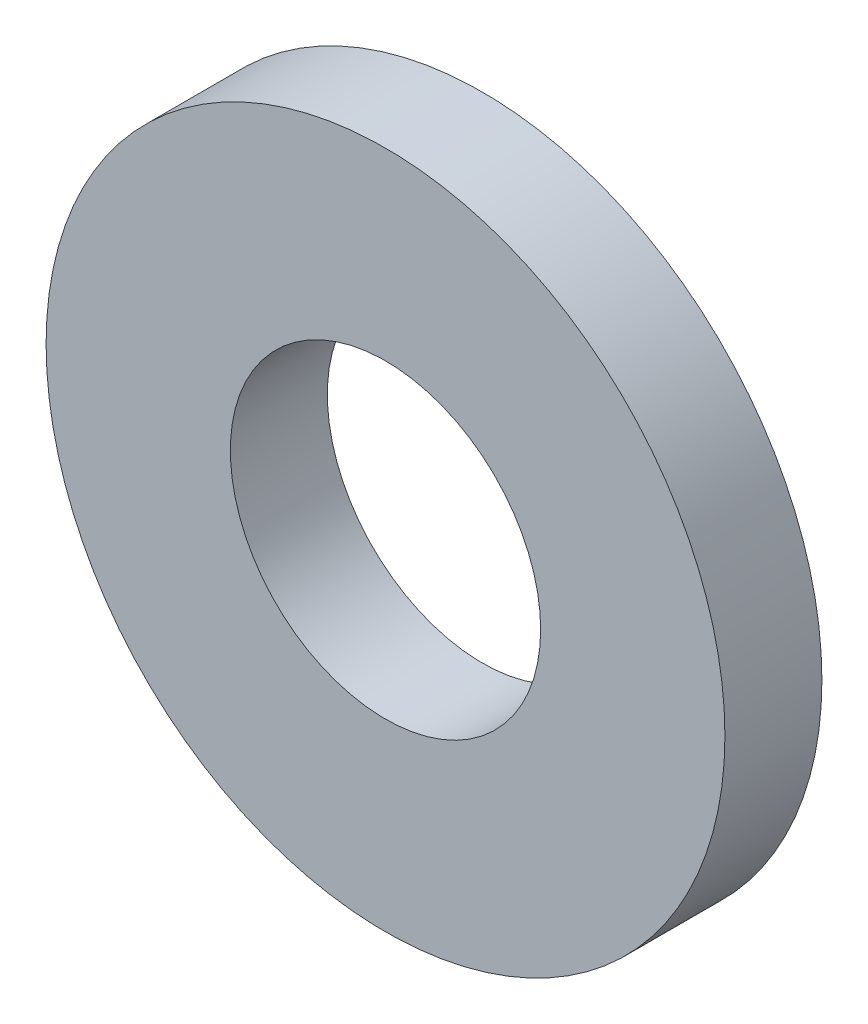
ISO-10303-21;
HEADER;
FILE_DESCRIPTION(('STEP AP214'),'2;1');
FILE_NAME('part.step','',(''),(''),'','','');
FILE_SCHEMA(('AUTOMOTIVE_DESIGN { 1 0 10303 214 1 1 1 1 }'));
ENDSEC;
DATA;
#1=APPLICATION_CONTEXT('core data for automotive mechanical design processes');
#2=APPLICATION_PROTOCOL_DEFINITION('international standard','automotive_design',2000,#1);
#3=PRODUCT_CONTEXT('',#1,'mechanical');
#4=PRODUCT('Part','Part','',(#3));
#5=PRODUCT_RELATED_PRODUCT_CATEGORY('part','',(#4));
#6=PRODUCT_DEFINITION_FORMATION('','',#4);
#7=PRODUCT_DEFINITION_CONTEXT('part definition',#1,'design');
#8=PRODUCT_DEFINITION('design','',#6,#7);
#9=PRODUCT_DEFINITION_SHAPE('','',#8);
#10=(LENGTH_UNIT() NAMED_UNIT(*) SI_UNIT(.MILLI.,.METRE.));
#11=(NAMED_UNIT(*) PLANE_ANGLE_UNIT() SI_UNIT($,.RADIAN.));
#12=(NAMED_UNIT(*) SI_UNIT($,.STERADIAN.) SOLID_ANGLE_UNIT());
#13=UNCERTAINTY_MEASURE_WITH_UNIT(LENGTH_MEASURE(1.E-05),#10,'distance_accuracy_value','');
#14=(GEOMETRIC_REPRESENTATION_CONTEXT(3) GLOBAL_UNCERTAINTY_ASSIGNED_CONTEXT((#13)) GLOBAL_UNIT_ASSIGNED_CONTEXT((#10,
#11,#12)) REPRESENTATION_CONTEXT('',''));
#15=CARTESIAN_POINT('',(0.,0.,0.));
#16=DIRECTION('',(0.,0.,1.));
#17=DIRECTION('',(1.,0.,0.));
#18=AXIS2_PLACEMENT_3D('',#15,#16,#17);
#19=CARTESIAN_POINT('',(0.,0.,1.));
#20=DIRECTION('',(0.,0.,1.));
#21=DIRECTION('',(1.,0.,0.));
#22=AXIS2_PLACEMENT_3D('',#19,#20,#21);
#23=PLANE('',#22);
#24=CARTESIAN_POINT('',(0.,0.,1.));
#25=DIRECTION('',(0.,0.,1.));
#26=DIRECTION('',(1.,0.,0.));
#27=AXIS2_PLACEMENT_3D('',#24,#25,#26);
#28=CIRCLE('',#27,3.5);
#29=CARTESIAN_POINT('',(3.5,0.,1.));
#30=VERTEX_POINT('',#29);
#31=EDGE_CURVE('E10',#30,#30,#28,.T.);
#32=ORIENTED_EDGE('',*,*,#31,.T.);
#33=EDGE_LOOP('',(#32));
#34=FACE_BOUND('',#33,.T.);
#35=CARTESIAN_POINT('',(0.,0.,1.));
#36=DIRECTION('',(0.,0.,1.));
#37=DIRECTION('',(1.,0.,0.));
#38=AXIS2_PLACEMENT_3D('',#35,#36,#37);
#39=CIRCLE('',#38,1.6);
#40=CARTESIAN_POINT('',(1.6,0.,1.));
#41=VERTEX_POINT('',#40);
#42=EDGE_CURVE('E46',#41,#41,#39,.T.);
#43=ORIENTED_EDGE('',*,*,#42,.F.);
#44=EDGE_LOOP('',(#43));
#45=FACE_BOUND('',#44,.T.);
#46=ADVANCED_FACE('F35',(#34,#45),#23,.T.);
#47=CARTESIAN_POINT('',(0.,0.,0.));
#48=DIRECTION('',(0.,0.,1.));
#49=DIRECTION('',(1.,0.,0.));
#50=AXIS2_PLACEMENT_3D('',#47,#48,#49);
#51=PLANE('',#50);
#52=CARTESIAN_POINT('',(0.,0.,0.));
#53=DIRECTION('',(0.,0.,1.));
#54=DIRECTION('',(1.,0.,0.));
#55=AXIS2_PLACEMENT_3D('',#52,#53,#54);
#56=CIRCLE('',#55,3.5);
#57=CARTESIAN_POINT('',(3.5,0.,0.));
#58=VERTEX_POINT('',#57);
#59=EDGE_CURVE('E39',#58,#58,#56,.T.);
#60=ORIENTED_EDGE('',*,*,#59,.F.);
#61=EDGE_LOOP('',(#60));
#62=FACE_BOUND('',#61,.T.);
#63=CARTESIAN_POINT('',(0.,0.,0.));
#64=DIRECTION('',(0.,0.,1.));
#65=DIRECTION('',(1.,0.,0.));
#66=AXIS2_PLACEMENT_3D('',#63,#64,#65);
#67=CIRCLE('',#66,1.6);
#68=CARTESIAN_POINT('',(1.6,0.,0.));
#69=VERTEX_POINT('',#68);
#70=EDGE_CURVE('E48',#69,#69,#67,.T.);
#71=ORIENTED_EDGE('',*,*,#70,.T.);
#72=EDGE_LOOP('',(#71));
#73=FACE_BOUND('',#72,.T.);
#74=ADVANCED_FACE('F58',(#62,#73),#51,.F.);
#75=CARTESIAN_POINT('',(0.,0.,1.));
#76=DIRECTION('',(0.,0.,-1.));
#77=DIRECTION('',(-1.,0.,0.));
#78=AXIS2_PLACEMENT_3D('',#75,#76,#77);
#79=CYLINDRICAL_SURFACE('',#78,3.5);
#80=ORIENTED_EDGE('',*,*,#31,.F.);
#81=EDGE_LOOP('',(#80));
#82=FACE_BOUND('',#81,.T.);
#83=ORIENTED_EDGE('',*,*,#59,.T.);
#84=EDGE_LOOP('',(#83));
#85=FACE_BOUND('',#84,.T.);
#86=ADVANCED_FACE('F37',(#82,#85),#79,.T.);
#87=CARTESIAN_POINT('',(0.,0.,1.));
#88=DIRECTION('',(0.,0.,-1.));
#89=DIRECTION('',(-1.,0.,0.));
#90=AXIS2_PLACEMENT_3D('',#87,#88,#89);
#91=CYLINDRICAL_SURFACE('',#90,1.6);
#92=ORIENTED_EDGE('',*,*,#42,.T.);
#93=EDGE_LOOP('',(#92));
#94=FACE_BOUND('',#93,.T.);
#95=ORIENTED_EDGE('',*,*,#70,.F.);
#96=EDGE_LOOP('',(#95));
#97=FACE_BOUND('',#96,.T.);
#98=ADVANCED_FACE('F54',(#94,#97),#91,.F.);
#99=CLOSED_SHELL('',(#46,#74,#86,#98));
#100=MANIFOLD_SOLID_BREP('B2',#99);
#101=ADVANCED_BREP_SHAPE_REPRESENTATION('',(#18,#100),#14);
#102=SHAPE_DEFINITION_REPRESENTATION(#9,#101);
ENDSEC;
END-ISO-10303-21;
